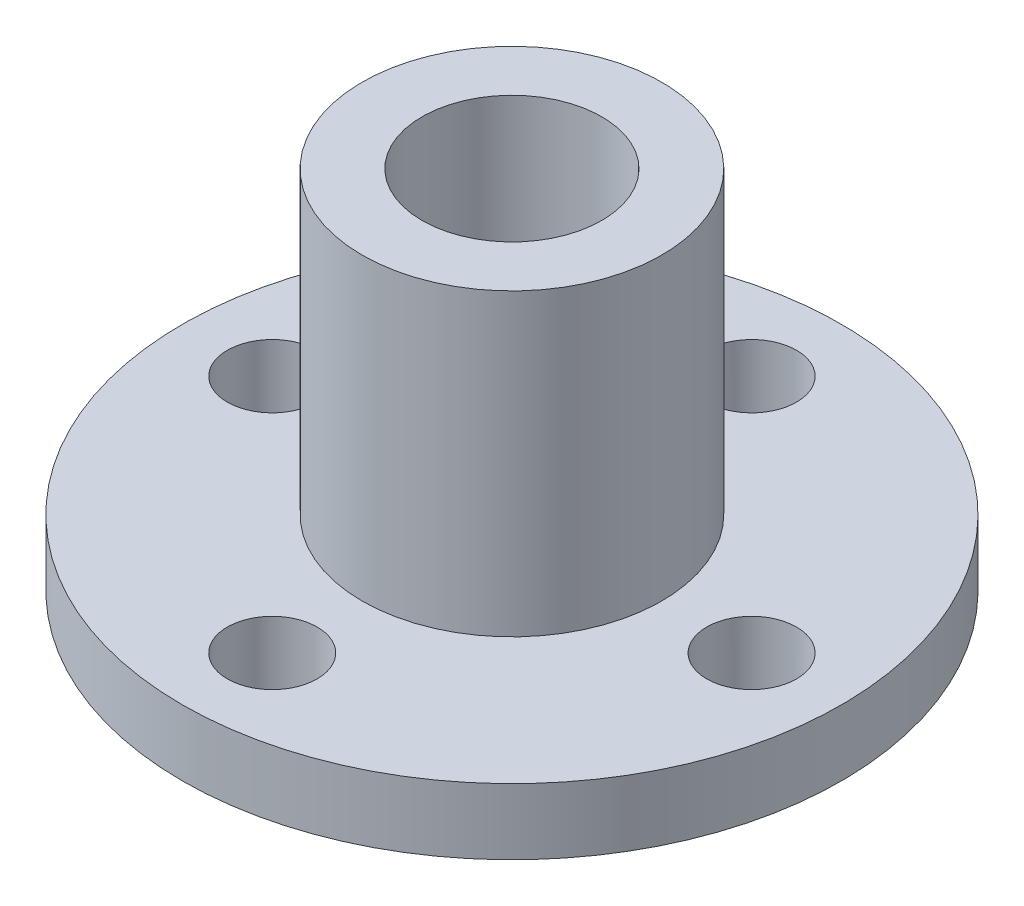
ISO-10303-21;
HEADER;
FILE_DESCRIPTION(('STEP AP214'),'2;1');
FILE_NAME('part.step','',(''),(''),'','','');
FILE_SCHEMA(('AUTOMOTIVE_DESIGN { 1 0 10303 214 1 1 1 1 }'));
ENDSEC;
DATA;
#1=APPLICATION_CONTEXT('core data for automotive mechanical design processes');
#2=APPLICATION_PROTOCOL_DEFINITION('international standard','automotive_design',2000,#1);
#3=PRODUCT_CONTEXT('',#1,'mechanical');
#4=PRODUCT('Part','Part','',(#3));
#5=PRODUCT_RELATED_PRODUCT_CATEGORY('part','',(#4));
#6=PRODUCT_DEFINITION_FORMATION('','',#4);
#7=PRODUCT_DEFINITION_CONTEXT('part definition',#1,'design');
#8=PRODUCT_DEFINITION('design','',#6,#7);
#9=PRODUCT_DEFINITION_SHAPE('','',#8);
#10=(LENGTH_UNIT() NAMED_UNIT(*) SI_UNIT(.MILLI.,.METRE.));
#11=(NAMED_UNIT(*) PLANE_ANGLE_UNIT() SI_UNIT($,.RADIAN.));
#12=(NAMED_UNIT(*) SI_UNIT($,.STERADIAN.) SOLID_ANGLE_UNIT());
#13=UNCERTAINTY_MEASURE_WITH_UNIT(LENGTH_MEASURE(1.E-05),#10,'distance_accuracy_value','');
#14=(GEOMETRIC_REPRESENTATION_CONTEXT(3) GLOBAL_UNCERTAINTY_ASSIGNED_CONTEXT((#13)) GLOBAL_UNIT_ASSIGNED_CONTEXT((#10,
#11,#12)) REPRESENTATION_CONTEXT('',''));
#15=CARTESIAN_POINT('',(0.,0.,0.));
#16=DIRECTION('',(0.,0.,1.));
#17=DIRECTION('',(1.,0.,0.));
#18=AXIS2_PLACEMENT_3D('',#15,#16,#17);
#19=CARTESIAN_POINT('',(0.,2.2,0.));
#20=DIRECTION('',(0.,-1.,0.));
#21=DIRECTION('',(0.,0.,-1.));
#22=AXIS2_PLACEMENT_3D('',#19,#20,#21);
#23=CYLINDRICAL_SURFACE('',#22,11.);
#24=CARTESIAN_POINT('',(0.,2.2,0.));
#25=DIRECTION('',(0.,1.,0.));
#26=DIRECTION('',(0.,0.,1.));
#27=AXIS2_PLACEMENT_3D('',#24,#25,#26);
#28=CIRCLE('',#27,11.);
#29=CARTESIAN_POINT('',(0.,2.2,11.));
#30=VERTEX_POINT('',#29);
#31=EDGE_CURVE('E46',#30,#30,#28,.T.);
#32=ORIENTED_EDGE('',*,*,#31,.F.);
#33=EDGE_LOOP('',(#32));
#34=FACE_BOUND('',#33,.T.);
#35=CARTESIAN_POINT('',(0.,0.,0.));
#36=DIRECTION('',(0.,1.,0.));
#37=DIRECTION('',(0.,0.,1.));
#38=AXIS2_PLACEMENT_3D('',#35,#36,#37);
#39=CIRCLE('',#38,11.);
#40=CARTESIAN_POINT('',(0.,0.,11.));
#41=VERTEX_POINT('',#40);
#42=EDGE_CURVE('E51',#41,#41,#39,.T.);
#43=ORIENTED_EDGE('',*,*,#42,.T.);
#44=EDGE_LOOP('',(#43));
#45=FACE_BOUND('',#44,.T.);
#46=ADVANCED_FACE('F39',(#34,#45),#23,.T.);
#47=CARTESIAN_POINT('',(0.,2.2,0.));
#48=DIRECTION('',(0.,1.,0.));
#49=DIRECTION('',(0.,0.,1.));
#50=AXIS2_PLACEMENT_3D('',#47,#48,#49);
#51=PLANE('',#50);
#52=CARTESIAN_POINT('',(0.,2.2,-8.));
#53=DIRECTION('',(0.,1.,0.));
#54=DIRECTION('',(-1.,0.,0.));
#55=AXIS2_PLACEMENT_3D('',#52,#53,#54);
#56=CIRCLE('',#55,1.5);
#57=CARTESIAN_POINT('',(-1.49999999999997,2.2,-8.00000000000001));
#58=VERTEX_POINT('',#57);
#59=EDGE_CURVE('E198',#58,#58,#56,.T.);
#60=ORIENTED_EDGE('',*,*,#59,.F.);
#61=EDGE_LOOP('',(#60));
#62=FACE_BOUND('',#61,.T.);
#63=CARTESIAN_POINT('',(8.,2.2,0.));
#64=DIRECTION('',(0.,1.,0.));
#65=DIRECTION('',(0.,0.,-1.));
#66=AXIS2_PLACEMENT_3D('',#63,#64,#65);
#67=CIRCLE('',#66,1.5);
#68=CARTESIAN_POINT('',(8.,2.2,-1.5));
#69=VERTEX_POINT('',#68);
#70=EDGE_CURVE('E208',#69,#69,#67,.T.);
#71=ORIENTED_EDGE('',*,*,#70,.F.);
#72=EDGE_LOOP('',(#71));
#73=FACE_BOUND('',#72,.T.);
#74=CARTESIAN_POINT('',(0.,2.2,8.));
#75=DIRECTION('',(0.,1.,0.));
#76=DIRECTION('',(1.,0.,0.));
#77=AXIS2_PLACEMENT_3D('',#74,#75,#76);
#78=CIRCLE('',#77,1.5);
#79=CARTESIAN_POINT('',(1.49999999999992,2.2,8.00000000000002));
#80=VERTEX_POINT('',#79);
#81=EDGE_CURVE('E211',#80,#80,#78,.T.);
#82=ORIENTED_EDGE('',*,*,#81,.F.);
#83=EDGE_LOOP('',(#82));
#84=FACE_BOUND('',#83,.T.);
#85=CARTESIAN_POINT('',(-8.,2.2,0.));
#86=DIRECTION('',(0.,1.,0.));
#87=DIRECTION('',(0.,0.,1.));
#88=AXIS2_PLACEMENT_3D('',#85,#86,#87);
#89=CIRCLE('',#88,1.5);
#90=CARTESIAN_POINT('',(-8.,2.2,1.5));
#91=VERTEX_POINT('',#90);
#92=EDGE_CURVE('E90',#91,#91,#89,.T.);
#93=ORIENTED_EDGE('',*,*,#92,.F.);
#94=EDGE_LOOP('',(#93));
#95=FACE_BOUND('',#94,.T.);
#96=CARTESIAN_POINT('',(0.,2.2,0.));
#97=DIRECTION('',(0.,1.,0.));
#98=DIRECTION('',(0.,0.,1.));
#99=AXIS2_PLACEMENT_3D('',#96,#97,#98);
#100=CIRCLE('',#99,5.);
#101=CARTESIAN_POINT('',(0.,2.2,5.));
#102=VERTEX_POINT('',#101);
#103=EDGE_CURVE('E10',#102,#102,#100,.T.);
#104=ORIENTED_EDGE('',*,*,#103,.F.);
#105=EDGE_LOOP('',(#104));
#106=FACE_BOUND('',#105,.T.);
#107=ORIENTED_EDGE('',*,*,#31,.T.);
#108=EDGE_LOOP('',(#107));
#109=FACE_BOUND('',#108,.T.);
#110=ADVANCED_FACE('F99',(#62,#73,#84,#95,#106,#109),#51,.T.);
#111=CARTESIAN_POINT('',(0.,0.,0.));
#112=DIRECTION('',(0.,1.,0.));
#113=DIRECTION('',(0.,0.,1.));
#114=AXIS2_PLACEMENT_3D('',#111,#112,#113);
#115=PLANE('',#114);
#116=CARTESIAN_POINT('',(0.,0.,-8.));
#117=DIRECTION('',(0.,1.,0.));
#118=DIRECTION('',(0.,0.,1.));
#119=AXIS2_PLACEMENT_3D('',#116,#117,#118);
#120=CIRCLE('',#119,1.5);
#121=CARTESIAN_POINT('',(0.,0.,-6.5));
#122=VERTEX_POINT('',#121);
#123=EDGE_CURVE('E42',#122,#122,#120,.T.);
#124=ORIENTED_EDGE('',*,*,#123,.T.);
#125=EDGE_LOOP('',(#124));
#126=FACE_BOUND('',#125,.T.);
#127=CARTESIAN_POINT('',(8.,0.,0.));
#128=DIRECTION('',(0.,1.,0.));
#129=DIRECTION('',(0.,0.,1.));
#130=AXIS2_PLACEMENT_3D('',#127,#128,#129);
#131=CIRCLE('',#130,1.5);
#132=CARTESIAN_POINT('',(8.,0.,1.5));
#133=VERTEX_POINT('',#132);
#134=EDGE_CURVE('E200',#133,#133,#131,.T.);
#135=ORIENTED_EDGE('',*,*,#134,.T.);
#136=EDGE_LOOP('',(#135));
#137=FACE_BOUND('',#136,.T.);
#138=CARTESIAN_POINT('',(0.,0.,8.));
#139=DIRECTION('',(0.,1.,0.));
#140=DIRECTION('',(0.,0.,1.));
#141=AXIS2_PLACEMENT_3D('',#138,#139,#140);
#142=CIRCLE('',#141,1.5);
#143=CARTESIAN_POINT('',(0.,0.,9.5));
#144=VERTEX_POINT('',#143);
#145=EDGE_CURVE('E203',#144,#144,#142,.T.);
#146=ORIENTED_EDGE('',*,*,#145,.T.);
#147=EDGE_LOOP('',(#146));
#148=FACE_BOUND('',#147,.T.);
#149=CARTESIAN_POINT('',(-8.,0.,0.));
#150=DIRECTION('',(0.,1.,0.));
#151=DIRECTION('',(0.,0.,1.));
#152=AXIS2_PLACEMENT_3D('',#149,#150,#151);
#153=CIRCLE('',#152,1.5);
#154=CARTESIAN_POINT('',(-8.,0.,1.5));
#155=VERTEX_POINT('',#154);
#156=EDGE_CURVE('E68',#155,#155,#153,.T.);
#157=ORIENTED_EDGE('',*,*,#156,.T.);
#158=EDGE_LOOP('',(#157));
#159=FACE_BOUND('',#158,.T.);
#160=CARTESIAN_POINT('',(0.,0.,0.));
#161=DIRECTION('',(0.,1.,0.));
#162=DIRECTION('',(0.,0.,1.));
#163=AXIS2_PLACEMENT_3D('',#160,#161,#162);
#164=CIRCLE('',#163,3.);
#165=CARTESIAN_POINT('',(0.,0.,3.));
#166=VERTEX_POINT('',#165);
#167=EDGE_CURVE('E227',#166,#166,#164,.T.);
#168=ORIENTED_EDGE('',*,*,#167,.T.);
#169=EDGE_LOOP('',(#168));
#170=FACE_BOUND('',#169,.T.);
#171=ORIENTED_EDGE('',*,*,#42,.F.);
#172=EDGE_LOOP('',(#171));
#173=FACE_BOUND('',#172,.T.);
#174=ADVANCED_FACE('F97',(#126,#137,#148,#159,#170,#173),#115,.F.);
#175=CARTESIAN_POINT('',(0.,12.2,0.));
#176=DIRECTION('',(0.,-1.,0.));
#177=DIRECTION('',(0.,0.,-1.));
#178=AXIS2_PLACEMENT_3D('',#175,#176,#177);
#179=CYLINDRICAL_SURFACE('',#178,5.);
#180=CARTESIAN_POINT('',(0.,8.7,-5.));
#181=CARTESIAN_POINT('',(-0.0822886127533,8.69999900251512,-4.9999992925055));
#182=CARTESIAN_POINT('',(-0.16458731835153,8.69320613637604,-4.99794915693954));
#183=CARTESIAN_POINT('',(-0.326788125304881,8.6662786457779,-4.98997105593691));
#184=CARTESIAN_POINT('',(-0.40668950441142,8.64614004197666,-4.98404193389692));
#185=CARTESIAN_POINT('',(-0.561732707754526,8.59325398308974,-4.96895552501836));
#186=CARTESIAN_POINT('',(-0.636881364395373,8.56052513038106,-4.95980300250425));
#187=CARTESIAN_POINT('',(-0.780624181053131,8.48346390694417,-4.93922109237645));
#188=CARTESIAN_POINT('',(-0.84921746746967,8.43912999260458,-4.92779140192067));
#189=CARTESIAN_POINT('',(-0.979871797183745,8.33877599252733,-4.90350737192774));
#190=CARTESIAN_POINT('',(-1.04171807124434,8.28248337411409,-4.89062383657036));
#191=CARTESIAN_POINT('',(-1.15524920923324,8.16039077008982,-4.86505834210442));
#192=CARTESIAN_POINT('',(-1.20693236327441,8.09458918787504,-4.85237641724501));
#193=CARTESIAN_POINT('',(-1.29980037723708,7.95352924696239,-4.82834113993772));
#194=CARTESIAN_POINT('',(-1.34072309022213,7.87809153900926,-4.81702406663875));
#195=CARTESIAN_POINT('',(-1.4092139477476,7.72101074576971,-4.79743620394031));
#196=CARTESIAN_POINT('',(-1.43678529919973,7.63936915607202,-4.78916468313311));
#197=CARTESIAN_POINT('',(-1.47701633682652,7.47460973386954,-4.77690870838434));
#198=CARTESIAN_POINT('',(-1.49007196234677,7.39159725613606,-4.77281069324533));
#199=CARTESIAN_POINT('',(-1.50213730614672,7.22446684378323,-4.76902789749767));
#200=CARTESIAN_POINT('',(-1.50115042761078,7.14034918194091,-4.76934204760571));
#201=CARTESIAN_POINT('',(-1.48546977199812,6.97661609139152,-4.77424744067778));
#202=CARTESIAN_POINT('',(-1.47127205262685,6.89694774963776,-4.7786838859914));
#203=CARTESIAN_POINT('',(-1.43037420427056,6.74118021372654,-4.79108356228624));
#204=CARTESIAN_POINT('',(-1.40367284141641,6.66508137262567,-4.79904714132351));
#205=CARTESIAN_POINT('',(-1.33816026653682,6.51739965033926,-4.81772733074973));
#206=CARTESIAN_POINT('',(-1.29918816934643,6.44589291604474,-4.82848016115952));
#207=CARTESIAN_POINT('',(-1.21035222588683,6.31026797798981,-4.85150987000065));
#208=CARTESIAN_POINT('',(-1.16048574002588,6.24615157058622,-4.86378711746991));
#209=CARTESIAN_POINT('',(-1.04881290765546,6.12431380923798,-4.88911011297937));
#210=CARTESIAN_POINT('',(-0.986594907466972,6.06697133597033,-4.90216654310498));
#211=CARTESIAN_POINT('',(-0.853263259313967,5.96344601593575,-4.92712244063259));
#212=CARTESIAN_POINT('',(-0.782149051860887,5.91726387158557,-4.9390218351841));
#213=CARTESIAN_POINT('',(-0.632355038342803,5.83714007753527,-4.9604316006947));
#214=CARTESIAN_POINT('',(-0.55362774974795,5.80328248375014,-4.96992543668314));
#215=CARTESIAN_POINT('',(-0.391245415603519,5.74940040990037,-4.98533521832222));
#216=CARTESIAN_POINT('',(-0.307591751589581,5.72937207146751,-4.99125216186999));
#217=CARTESIAN_POINT('',(-0.140952242668331,5.70434782210061,-4.99868364643538));
#218=CARTESIAN_POINT('',(-0.0580500976011867,5.69883841419839,-5.0003485041779));
#219=CARTESIAN_POINT('',(0.107499605823383,5.70156915571208,-4.9995292324176));
#220=CARTESIAN_POINT('',(0.190147196690781,5.70980746965144,-4.99704565677756));
#221=CARTESIAN_POINT('',(0.350903605309697,5.7393846111115,-4.98830696987163));
#222=CARTESIAN_POINT('',(0.429072772614169,5.76042338758087,-4.98213829799417));
#223=CARTESIAN_POINT('',(0.580754638954522,5.8146432327782,-4.96674347841533));
#224=CARTESIAN_POINT('',(0.654266777025584,5.84782576103786,-4.95751696321085));
#225=CARTESIAN_POINT('',(0.796437189461052,5.92625316548113,-4.93669654351325));
#226=CARTESIAN_POINT('',(0.86494382619967,5.97175934094797,-4.92505280829675));
#227=CARTESIAN_POINT('',(0.993523307980147,6.07322475405281,-4.90073468764318));
#228=CARTESIAN_POINT('',(1.05359403235593,6.12918661188767,-4.8880600443108));
#229=CARTESIAN_POINT('',(1.16585744551027,6.25238730836935,-4.86253171869138));
#230=CARTESIAN_POINT('',(1.21768481231503,6.31996187577174,-4.84968825033268));
#231=CARTESIAN_POINT('',(1.30928995072154,6.46312793901353,-4.82576515238463));
#232=CARTESIAN_POINT('',(1.34906803829472,6.53871922455821,-4.81468547654651));
#233=CARTESIAN_POINT('',(1.41517347127168,6.69553249125469,-4.79567189615055));
#234=CARTESIAN_POINT('',(1.4415634693705,6.77672618653659,-4.78772337843827));
#235=CARTESIAN_POINT('',(1.48021730815114,6.94268796893148,-4.77591594362794));
#236=CARTESIAN_POINT('',(1.49248598978779,7.02745482078767,-4.772055625083));
#237=CARTESIAN_POINT('',(1.50221984485059,7.19436151837623,-4.76899972496087));
#238=CARTESIAN_POINT('',(1.5002805530849,7.27646365101759,-4.76961647442754));
#239=CARTESIAN_POINT('',(1.48307505444813,7.4391141033728,-4.77499401288294));
#240=CARTESIAN_POINT('',(1.46780938124716,7.51966248517635,-4.77975463592551));
#241=CARTESIAN_POINT('',(1.42476888804136,7.67594539914285,-4.79275763670386));
#242=CARTESIAN_POINT('',(1.39715175507068,7.75172728736169,-4.80095604545965));
#243=CARTESIAN_POINT('',(1.33031507121129,7.89764243881772,-4.81990278909136));
#244=CARTESIAN_POINT('',(1.29109329962876,7.96777461764076,-4.83065161194312));
#245=CARTESIAN_POINT('',(1.20048763805072,8.10316311652711,-4.85397676425833));
#246=CARTESIAN_POINT('',(1.14871276092994,8.16814876126041,-4.86660540163798));
#247=CARTESIAN_POINT('',(1.03517434629782,8.28870249830786,-4.89201320450026));
#248=CARTESIAN_POINT('',(0.973408217134501,8.34426813946776,-4.90479240823905));
#249=CARTESIAN_POINT('',(0.839465762183248,8.44602341229503,-4.92950936570649));
#250=CARTESIAN_POINT('',(0.767037885790608,8.49189144685549,-4.94141159765674));
#251=CARTESIAN_POINT('',(0.61514137398353,8.57073516990403,-4.96260680455813));
#252=CARTESIAN_POINT('',(0.535676052998955,8.60371688827451,-4.97190099931067));
#253=CARTESIAN_POINT('',(0.380757712655281,8.65289527565275,-4.98602174969301));
#254=CARTESIAN_POINT('',(0.305786961954234,8.67051167288325,-4.99122027381068));
#255=CARTESIAN_POINT('',(0.153880195230779,8.69406352524158,-4.99820944494492));
#256=CARTESIAN_POINT('',(0.0769445098581395,8.70000093270482,-5.0000006615474));
#257=CARTESIAN_POINT('',(0.,8.7,-5.));
#258=B_SPLINE_CURVE_WITH_KNOTS('',3,(#180,#181,#182,#183,#184,#185,#186,#187,#188,#189,#190,
#191,#192,#193,#194,#195,#196,#197,#198,#199,#200,#201,#202,#203,#204,#205,#206,#207,#208,#209,
#210,#211,#212,#213,#214,#215,#216,#217,#218,#219,#220,#221,#222,#223,#224,#225,#226,#227,#228,
#229,#230,#231,#232,#233,#234,#235,#236,#237,#238,#239,#240,#241,#242,#243,#244,#245,#246,#247,
#248,#249,#250,#251,#252,#253,#254,#255,#256,#257),.UNSPECIFIED.,.T.,.F.,(4,2,2,2,2,2,2,2,2,2,2,
2,2,2,2,2,2,2,2,2,2,2,2,2,2,2,2,2,2,2,2,2,2,2,2,2,2,2,4),(0.,0.246583203612611,0.493239964846,
0.739533676300874,0.985860164412702,1.23855602948192,1.49129437288633,1.74971481004109,
2.00807314543224,2.25919689356599,2.51025978319089,2.75226016697676,2.99428443658001,
3.23962426447119,3.48502360158555,3.74067104048167,3.99633456531072,4.25371046881689,
4.51101453528808,4.75908809438545,5.00712853550327,5.24956746682327,5.49203554593729,
5.74011305702908,5.98825282000191,6.24540400322819,6.50254844252681,6.75847814951252,
7.01432009460283,7.25950155466943,7.504673196616,7.74680040402721,7.98897397553107,
8.23996925679931,8.49102974897502,8.74942996156671,9.00770911595235,9.2383169193046,
9.46888616948875),.UNSPECIFIED.);
#259=CARTESIAN_POINT('',(0.,8.7,-5.));
#260=VERTEX_POINT('',#259);
#261=EDGE_CURVE('E67',#260,#260,#258,.T.);
#262=ORIENTED_EDGE('',*,*,#261,.T.);
#263=EDGE_LOOP('',(#262));
#264=FACE_BOUND('',#263,.T.);
#265=CARTESIAN_POINT('',(0.,12.2,0.));
#266=DIRECTION('',(0.,1.,0.));
#267=DIRECTION('',(0.,0.,1.));
#268=AXIS2_PLACEMENT_3D('',#265,#266,#267);
#269=CIRCLE('',#268,5.);
#270=CARTESIAN_POINT('',(0.,12.2,5.));
#271=VERTEX_POINT('',#270);
#272=EDGE_CURVE('E54',#271,#271,#269,.T.);
#273=ORIENTED_EDGE('',*,*,#272,.F.);
#274=EDGE_LOOP('',(#273));
#275=FACE_BOUND('',#274,.T.);
#276=ORIENTED_EDGE('',*,*,#103,.T.);
#277=EDGE_LOOP('',(#276));
#278=FACE_BOUND('',#277,.T.);
#279=ADVANCED_FACE('F92',(#264,#275,#278),#179,.T.);
#280=CARTESIAN_POINT('',(0.,12.2,0.));
#281=DIRECTION('',(0.,1.,0.));
#282=DIRECTION('',(0.,0.,1.));
#283=AXIS2_PLACEMENT_3D('',#280,#281,#282);
#284=PLANE('',#283);
#285=CARTESIAN_POINT('',(0.,12.2,0.));
#286=DIRECTION('',(0.,1.,0.));
#287=DIRECTION('',(0.,0.,1.));
#288=AXIS2_PLACEMENT_3D('',#285,#286,#287);
#289=CIRCLE('',#288,3.);
#290=CARTESIAN_POINT('',(0.,12.2,3.));
#291=VERTEX_POINT('',#290);
#292=EDGE_CURVE('E89',#291,#291,#289,.T.);
#293=ORIENTED_EDGE('',*,*,#292,.F.);
#294=EDGE_LOOP('',(#293));
#295=FACE_BOUND('',#294,.T.);
#296=ORIENTED_EDGE('',*,*,#272,.T.);
#297=EDGE_LOOP('',(#296));
#298=FACE_BOUND('',#297,.T.);
#299=ADVANCED_FACE('F96',(#295,#298),#284,.T.);
#300=CARTESIAN_POINT('',(0.,-2.8,0.));
#301=DIRECTION('',(0.,1.,0.));
#302=DIRECTION('',(0.,0.,1.));
#303=AXIS2_PLACEMENT_3D('',#300,#301,#302);
#304=CYLINDRICAL_SURFACE('',#303,3.);
#305=CARTESIAN_POINT('',(1.5,7.2,-2.59807621135332));
#306=CARTESIAN_POINT('',(1.4999945446118,7.12183828770713,-2.59808302092689));
#307=CARTESIAN_POINT('',(1.49384995609983,7.04357788271243,-2.60165701781635));
#308=CARTESIAN_POINT('',(1.46958481484708,6.88945910298427,-2.61543549678079));
#309=CARTESIAN_POINT('',(1.45143909683127,6.81360612743489,-2.62565391083339));
#310=CARTESIAN_POINT('',(1.40414992304972,6.66682250348409,-2.65124019908098));
#311=CARTESIAN_POINT('',(1.3750649287406,6.59586802128962,-2.66658065209878));
#312=CARTESIAN_POINT('',(1.30690128806456,6.45986369700492,-2.70063997225287));
#313=CARTESIAN_POINT('',(1.26782210105366,6.39481417460631,-2.71935902214097));
#314=CARTESIAN_POINT('',(1.17699981079632,6.26654140716374,-2.75995303586162));
#315=CARTESIAN_POINT('',(1.12447805421566,6.20391129648968,-2.7819609545693));
#316=CARTESIAN_POINT('',(1.0098807114217,6.08788741738994,-2.82557974178559));
#317=CARTESIAN_POINT('',(0.94780038867344,6.03449825612472,-2.84719040746875));
#318=CARTESIAN_POINT('',(0.81073434512182,5.93494927327851,-2.88932215429424));
#319=CARTESIAN_POINT('',(0.735160783518862,5.88951934821071,-2.90967159627259));
#320=CARTESIAN_POINT('',(0.576235539899256,5.81228872013136,-2.94526134149294));
#321=CARTESIAN_POINT('',(0.492888807207232,5.78047941579424,-2.96050486775612));
#322=CARTESIAN_POINT('',(0.327067415888965,5.73374300804835,-2.98320691866356));
#323=CARTESIAN_POINT('',(0.244952685733226,5.7177757104667,-2.99114220331338));
#324=CARTESIAN_POINT('',(0.0788559430467717,5.69975082198744,-3.00011375769101));
#325=CARTESIAN_POINT('',(-0.00512490876560822,5.69768481480643,-3.00115420176885));
#326=CARTESIAN_POINT('',(-0.164748786635625,5.70712001095553,-2.99644472874675));
#327=CARTESIAN_POINT('',(-0.240481798765188,5.71745702328183,-2.99127743838241));
#328=CARTESIAN_POINT('',(-0.388970657877483,5.74932126585699,-2.97561367889621));
#329=CARTESIAN_POINT('',(-0.461726281640889,5.77084933346434,-2.96511681099591));
#330=CARTESIAN_POINT('',(-0.603464087354331,5.82462384913472,-2.93957374931482));
#331=CARTESIAN_POINT('',(-0.672380135272768,5.8570144697581,-2.92446662293799));
#332=CARTESIAN_POINT('',(-0.803965202269994,5.93139512430224,-2.89106468980031));
#333=CARTESIAN_POINT('',(-0.866631973257969,5.97338859495353,-2.87276874236226));
#334=CARTESIAN_POINT('',(-0.990260491347293,6.07034302729952,-2.83266591598844));
#335=CARTESIAN_POINT('',(-1.05050111254404,6.12615454248902,-2.81069063997263));
#336=CARTESIAN_POINT('',(-1.16115655544667,6.24688458739527,-2.76681510880217));
#337=CARTESIAN_POINT('',(-1.21156381736135,6.31181005841109,-2.74491492398443));
#338=CARTESIAN_POINT('',(-1.30425800196332,6.45397228863613,-2.70216234138727));
#339=CARTESIAN_POINT('',(-1.34582597246708,6.53172903458132,-2.68146479986061));
#340=CARTESIAN_POINT('',(-1.41497866950185,6.6944065070385,-2.64563175417864));
#341=CARTESIAN_POINT('',(-1.44257798731634,6.77931964952634,-2.63049045069101));
#342=CARTESIAN_POINT('',(-1.48077031653756,6.94682176692419,-2.60916953725552));
#343=CARTESIAN_POINT('',(-1.49253768317996,7.02906167856533,-2.60237483772745));
#344=CARTESIAN_POINT('',(-1.50227541991714,7.19460201227481,-2.59676879042414));
#345=CARTESIAN_POINT('',(-1.50025553597254,7.27790164367968,-2.59795180333967));
#346=CARTESIAN_POINT('',(-1.48355406501595,7.43348087786809,-2.60751504810877));
#347=CARTESIAN_POINT('',(-1.4702817250687,7.50596917666189,-2.61509381259981));
#348=CARTESIAN_POINT('',(-1.43354442694866,7.64755167940644,-2.63541032327012));
#349=CARTESIAN_POINT('',(-1.41007616793542,7.71664477611991,-2.64814974007551));
#350=CARTESIAN_POINT('',(-1.35247138290733,7.85311699635404,-2.67804333119485));
#351=CARTESIAN_POINT('',(-1.31789109553908,7.92026852528033,-2.69537464864595));
#352=CARTESIAN_POINT('',(-1.23943059602371,8.04820390730849,-2.73234179245875));
#353=CARTESIAN_POINT('',(-1.19554560649832,8.10898446526993,-2.75197880032721));
#354=CARTESIAN_POINT('',(-1.09325575079828,8.23046815128533,-2.79431997684504));
#355=CARTESIAN_POINT('',(-1.03371790847245,8.29019572607649,-2.81709874731434));
#356=CARTESIAN_POINT('',(-0.905106743097431,8.39911835699039,-2.86101352466839));
#357=CARTESIAN_POINT('',(-0.836030211983019,8.44830985534581,-2.88214897511564));
#358=CARTESIAN_POINT('',(-0.687803043838134,8.53586058892516,-2.92112042536435));
#359=CARTESIAN_POINT('',(-0.608434646361168,8.57389967731637,-2.93885462508044));
#360=CARTESIAN_POINT('',(-0.443283546961622,8.63570685578609,-2.96825032438952));
#361=CARTESIAN_POINT('',(-0.357506552088263,8.65948747704946,-2.9799171551456));
#362=CARTESIAN_POINT('',(-0.190469523495626,8.690052846262,-2.99501262272824));
#363=CARTESIAN_POINT('',(-0.109517165775685,8.69819681381417,-2.99909891862287));
#364=CARTESIAN_POINT('',(0.0526889789268058,8.7012648981816,-3.00063195562697));
#365=CARTESIAN_POINT('',(0.133942650442631,8.69619364278535,-2.99808102100335));
#366=CARTESIAN_POINT('',(0.288806988475722,8.67387538980656,-2.98700953256884));
#367=CARTESIAN_POINT('',(0.362568476716897,8.65745272611349,-2.97889342001985));
#368=CARTESIAN_POINT('',(0.506168928275428,8.61400950104554,-2.95788140495135));
#369=CARTESIAN_POINT('',(0.576007327433264,8.58698741985982,-2.94498481699193));
#370=CARTESIAN_POINT('',(0.713135109367328,8.52190942175104,-2.9148889612218));
#371=CARTESIAN_POINT('',(0.780187714050071,8.48343101518824,-2.89752925798199));
#372=CARTESIAN_POINT('',(0.907161962721038,8.39706310371142,-2.86032199712739));
#373=CARTESIAN_POINT('',(0.967080311122361,8.34916927632649,-2.84047329837541));
#374=CARTESIAN_POINT('',(1.08437100623534,8.23980429146594,-2.79792915339941));
#375=CARTESIAN_POINT('',(1.14089652680891,8.17745626878421,-2.77514698517547));
#376=CARTESIAN_POINT('',(1.24299493109201,8.04382391830534,-2.73094614244278));
#377=CARTESIAN_POINT('',(1.28855812501509,7.97253176869847,-2.70952868642798));
#378=CARTESIAN_POINT('',(1.36864661967848,7.82004503012857,-2.66999407957374));
#379=CARTESIAN_POINT('',(1.40277759894141,7.73860870330689,-2.65200261384405));
#380=CARTESIAN_POINT('',(1.45631806425962,7.57000139349033,-2.62299234492527));
#381=CARTESIAN_POINT('',(1.47577678676302,7.48285066663097,-2.61195024221553));
#382=CARTESIAN_POINT('',(1.49155051179662,7.362291966522,-2.60293908902686));
#383=CARTESIAN_POINT('',(1.49471415744578,7.32994815840317,-2.60112193507728));
#384=CARTESIAN_POINT('',(1.49894010763494,7.26507527897664,-2.59868903831625));
#385=CARTESIAN_POINT('',(1.50000227159981,7.23254619542119,-2.59807337587664));
#386=CARTESIAN_POINT('',(1.5,7.2,-2.59807621135332));
#387=B_SPLINE_CURVE_WITH_KNOTS('',3,(#305,#306,#307,#308,#309,#310,#311,#312,#313,#314,#315,
#316,#317,#318,#319,#320,#321,#322,#323,#324,#325,#326,#327,#328,#329,#330,#331,#332,#333,#334,
#335,#336,#337,#338,#339,#340,#341,#342,#343,#344,#345,#346,#347,#348,#349,#350,#351,#352,#353,
#354,#355,#356,#357,#358,#359,#360,#361,#362,#363,#364,#365,#366,#367,#368,#369,#370,#371,#372,
#373,#374,#375,#376,#377,#378,#379,#380,#381,#382,#383,#384,#385,#386),.UNSPECIFIED.,.T.,.F.,(4,
2,2,2,2,2,2,2,2,2,2,2,2,2,2,2,2,2,2,2,2,2,2,2,2,2,2,2,2,2,2,2,2,2,2,2,2,2,2,2,4),(0.,
0.234348183892072,0.469189339237207,0.702792893878329,0.936409088167725,1.18929346874735,
1.44230356626556,1.71236838358145,1.98226240445837,2.23295227451903,2.4834903552906,
2.71224146226808,2.94100968776183,3.1729430209672,3.40495949025408,3.65890787185336,
3.91305072368878,4.18333262594173,4.45333161317557,4.70193436281318,4.9503613978256,
5.17161275136038,5.39293578654095,5.62450944609132,5.85620229330071,6.1171011537092,
6.37808797467303,6.64596272119449,6.91360169713157,7.1566840558423,7.39968130190958,
7.62666637307239,7.8536840026802,8.09041126079208,8.32724745151079,8.58765362775102,
8.84828914267732,9.11716123557908,9.38512699504141,9.48270202777964,9.58028358741811),.UNSPECIFIED.);
#388=CARTESIAN_POINT('',(1.5,7.2,-2.59807621135332));
#389=VERTEX_POINT('',#388);
#390=EDGE_CURVE('E59',#389,#389,#387,.T.);
#391=ORIENTED_EDGE('',*,*,#390,.T.);
#392=EDGE_LOOP('',(#391));
#393=FACE_BOUND('',#392,.T.);
#394=ORIENTED_EDGE('',*,*,#292,.T.);
#395=EDGE_LOOP('',(#394));
#396=FACE_BOUND('',#395,.T.);
#397=ORIENTED_EDGE('',*,*,#167,.F.);
#398=EDGE_LOOP('',(#397));
#399=FACE_BOUND('',#398,.T.);
#400=ADVANCED_FACE('F70',(#393,#396,#399),#304,.F.);
#401=CARTESIAN_POINT('',(0.,7.2,-15.));
#402=DIRECTION('',(0.,0.,1.));
#403=DIRECTION('',(1.,0.,0.));
#404=AXIS2_PLACEMENT_3D('',#401,#402,#403);
#405=CYLINDRICAL_SURFACE('',#404,1.5);
#406=ORIENTED_EDGE('',*,*,#390,.F.);
#407=EDGE_LOOP('',(#406));
#408=FACE_BOUND('',#407,.T.);
#409=ORIENTED_EDGE('',*,*,#261,.F.);
#410=EDGE_LOOP('',(#409));
#411=FACE_BOUND('',#410,.T.);
#412=ADVANCED_FACE('F73',(#408,#411),#405,.F.);
#413=CARTESIAN_POINT('',(-8.,-12.8,0.));
#414=DIRECTION('',(0.,1.,0.));
#415=DIRECTION('',(0.,0.,1.));
#416=AXIS2_PLACEMENT_3D('',#413,#414,#415);
#417=CYLINDRICAL_SURFACE('',#416,1.5);
#418=ORIENTED_EDGE('',*,*,#92,.T.);
#419=EDGE_LOOP('',(#418));
#420=FACE_BOUND('',#419,.T.);
#421=ORIENTED_EDGE('',*,*,#156,.F.);
#422=EDGE_LOOP('',(#421));
#423=FACE_BOUND('',#422,.T.);
#424=ADVANCED_FACE('F77',(#420,#423),#417,.F.);
#425=CARTESIAN_POINT('',(0.,-12.8,8.));
#426=DIRECTION('',(0.,1.,0.));
#427=DIRECTION('',(0.,0.,1.));
#428=AXIS2_PLACEMENT_3D('',#425,#426,#427);
#429=CYLINDRICAL_SURFACE('',#428,1.5);
#430=ORIENTED_EDGE('',*,*,#81,.T.);
#431=EDGE_LOOP('',(#430));
#432=FACE_BOUND('',#431,.T.);
#433=ORIENTED_EDGE('',*,*,#145,.F.);
#434=EDGE_LOOP('',(#433));
#435=FACE_BOUND('',#434,.T.);
#436=ADVANCED_FACE('F149',(#432,#435),#429,.F.);
#437=CARTESIAN_POINT('',(8.,-12.8,0.));
#438=DIRECTION('',(0.,1.,0.));
#439=DIRECTION('',(0.,0.,1.));
#440=AXIS2_PLACEMENT_3D('',#437,#438,#439);
#441=CYLINDRICAL_SURFACE('',#440,1.5);
#442=ORIENTED_EDGE('',*,*,#70,.T.);
#443=EDGE_LOOP('',(#442));
#444=FACE_BOUND('',#443,.T.);
#445=ORIENTED_EDGE('',*,*,#134,.F.);
#446=EDGE_LOOP('',(#445));
#447=FACE_BOUND('',#446,.T.);
#448=ADVANCED_FACE('F172',(#444,#447),#441,.F.);
#449=CARTESIAN_POINT('',(0.,-12.8,-8.));
#450=DIRECTION('',(0.,1.,0.));
#451=DIRECTION('',(0.,0.,1.));
#452=AXIS2_PLACEMENT_3D('',#449,#450,#451);
#453=CYLINDRICAL_SURFACE('',#452,1.5);
#454=ORIENTED_EDGE('',*,*,#59,.T.);
#455=EDGE_LOOP('',(#454));
#456=FACE_BOUND('',#455,.T.);
#457=ORIENTED_EDGE('',*,*,#123,.F.);
#458=EDGE_LOOP('',(#457));
#459=FACE_BOUND('',#458,.T.);
#460=ADVANCED_FACE('F180',(#456,#459),#453,.F.);
#461=CLOSED_SHELL('',(#46,#110,#174,#279,#299,#400,#412,#424,#436,#448,#460));
#462=MANIFOLD_SOLID_BREP('B2',#461);
#463=ADVANCED_BREP_SHAPE_REPRESENTATION('',(#18,#462),#14);
#464=SHAPE_DEFINITION_REPRESENTATION(#9,#463);
ENDSEC;
END-ISO-10303-21;
